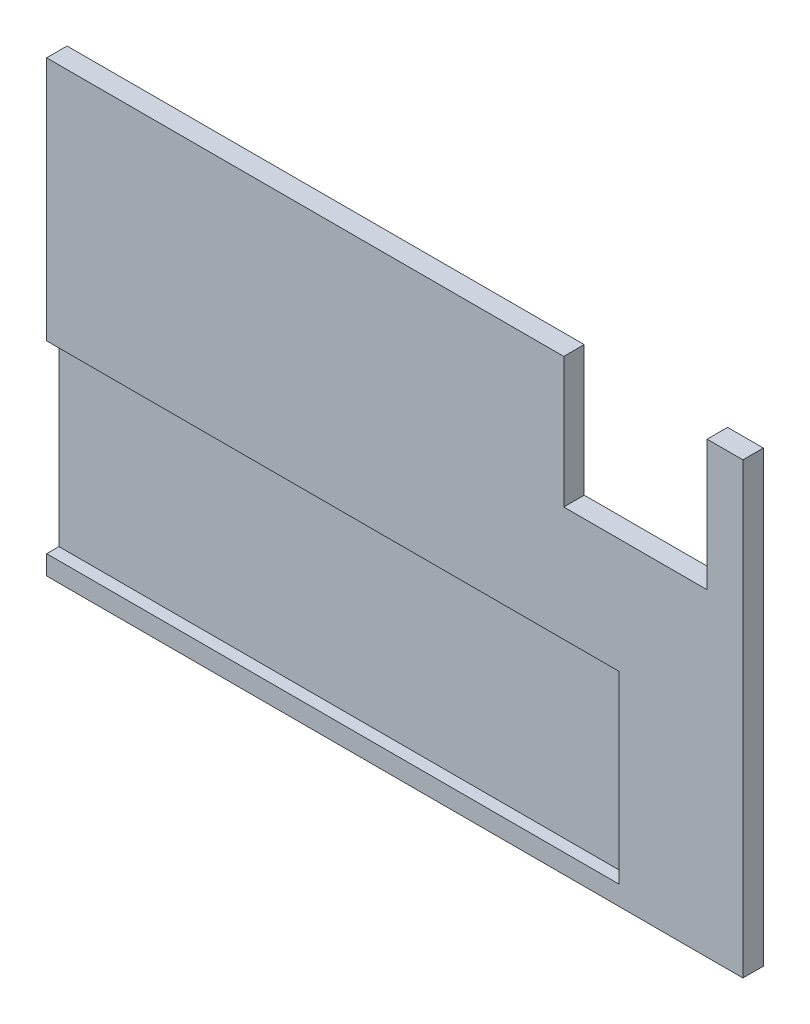
ISO-10303-21;
HEADER;
FILE_DESCRIPTION(('STEP AP214'),'2;1');
FILE_NAME('part.step','',(''),(''),'','','');
FILE_SCHEMA(('AUTOMOTIVE_DESIGN { 1 0 10303 214 1 1 1 1 }'));
ENDSEC;
DATA;
#1=APPLICATION_CONTEXT('core data for automotive mechanical design processes');
#2=APPLICATION_PROTOCOL_DEFINITION('international standard','automotive_design',2000,#1);
#3=PRODUCT_CONTEXT('',#1,'mechanical');
#4=PRODUCT('Part','Part','',(#3));
#5=PRODUCT_RELATED_PRODUCT_CATEGORY('part','',(#4));
#6=PRODUCT_DEFINITION_FORMATION('','',#4);
#7=PRODUCT_DEFINITION_CONTEXT('part definition',#1,'design');
#8=PRODUCT_DEFINITION('design','',#6,#7);
#9=PRODUCT_DEFINITION_SHAPE('','',#8);
#10=(LENGTH_UNIT() NAMED_UNIT(*) SI_UNIT(.MILLI.,.METRE.));
#11=(NAMED_UNIT(*) PLANE_ANGLE_UNIT() SI_UNIT($,.RADIAN.));
#12=(NAMED_UNIT(*) SI_UNIT($,.STERADIAN.) SOLID_ANGLE_UNIT());
#13=UNCERTAINTY_MEASURE_WITH_UNIT(LENGTH_MEASURE(1.E-05),#10,'distance_accuracy_value','');
#14=(GEOMETRIC_REPRESENTATION_CONTEXT(3) GLOBAL_UNCERTAINTY_ASSIGNED_CONTEXT((#13)) GLOBAL_UNIT_ASSIGNED_CONTEXT((#10,
#11,#12)) REPRESENTATION_CONTEXT('',''));
#15=CARTESIAN_POINT('',(0.,0.,0.));
#16=DIRECTION('',(0.,0.,1.));
#17=DIRECTION('',(1.,0.,0.));
#18=AXIS2_PLACEMENT_3D('',#15,#16,#17);
#19=CARTESIAN_POINT('',(-101.259492884196,106.840724775451,5.));
#20=DIRECTION('',(0.,-1.,0.));
#21=DIRECTION('',(0.,0.,-1.));
#22=AXIS2_PLACEMENT_3D('',#19,#20,#21);
#23=PLANE('',#22);
#24=DIRECTION('',(0.,0.,1.));
#25=VECTOR('',#24,1.);
#26=CARTESIAN_POINT('',(25.,106.840724775451,5.));
#27=LINE('',#26,#25);
#28=CARTESIAN_POINT('',(25.,106.840724775451,0.));
#29=VERTEX_POINT('',#28);
#30=CARTESIAN_POINT('',(25.,106.840724775451,5.));
#31=VERTEX_POINT('',#30);
#32=EDGE_CURVE('E136',#29,#31,#27,.T.);
#33=ORIENTED_EDGE('',*,*,#32,.F.);
#34=DIRECTION('',(-1.,0.,0.));
#35=VECTOR('',#34,1.);
#36=CARTESIAN_POINT('',(-101.259492884196,106.840724775451,0.));
#37=LINE('',#36,#35);
#38=CARTESIAN_POINT('',(-101.259492884196,106.840724775451,0.));
#39=VERTEX_POINT('',#38);
#40=EDGE_CURVE('E223',#29,#39,#37,.T.);
#41=ORIENTED_EDGE('',*,*,#40,.T.);
#42=DIRECTION('',(0.,0.,-1.));
#43=VECTOR('',#42,1.);
#44=CARTESIAN_POINT('',(-101.259492884196,106.840724775451,5.));
#45=LINE('',#44,#43);
#46=CARTESIAN_POINT('',(-101.259492884196,106.840724775451,5.));
#47=VERTEX_POINT('',#46);
#48=EDGE_CURVE('E236',#47,#39,#45,.T.);
#49=ORIENTED_EDGE('',*,*,#48,.F.);
#50=DIRECTION('',(-1.,0.,0.));
#51=VECTOR('',#50,1.);
#52=CARTESIAN_POINT('',(-101.259492884196,106.840724775451,5.));
#53=LINE('',#52,#51);
#54=EDGE_CURVE('E211',#31,#47,#53,.T.);
#55=ORIENTED_EDGE('',*,*,#54,.F.);
#56=EDGE_LOOP('',(#33,#41,#49,#55));
#57=FACE_BOUND('',#56,.T.);
#58=ADVANCED_FACE('F39',(#57),#23,.F.);
#59=DIRECTION('',(0.,0.,-1.));
#60=VECTOR('',#59,1.);
#61=CARTESIAN_POINT('',(60.,106.840724775451,5.));
#62=LINE('',#61,#60);
#63=CARTESIAN_POINT('',(60.,106.840724775451,5.));
#64=VERTEX_POINT('',#63);
#65=CARTESIAN_POINT('',(60.,106.840724775451,0.));
#66=VERTEX_POINT('',#65);
#67=EDGE_CURVE('E55',#64,#66,#62,.T.);
#68=ORIENTED_EDGE('',*,*,#67,.F.);
#69=CARTESIAN_POINT('',(68.7405071158039,106.840724775451,5.));
#70=VERTEX_POINT('',#69);
#71=EDGE_CURVE('E212',#70,#64,#53,.T.);
#72=ORIENTED_EDGE('',*,*,#71,.F.);
#73=DIRECTION('',(0.,0.,-1.));
#74=VECTOR('',#73,1.);
#75=CARTESIAN_POINT('',(68.7405071158039,106.840724775451,5.));
#76=LINE('',#75,#74);
#77=CARTESIAN_POINT('',(68.7405071158039,106.840724775451,0.));
#78=VERTEX_POINT('',#77);
#79=EDGE_CURVE('E240',#70,#78,#76,.T.);
#80=ORIENTED_EDGE('',*,*,#79,.T.);
#81=EDGE_CURVE('E224',#78,#66,#37,.T.);
#82=ORIENTED_EDGE('',*,*,#81,.T.);
#83=EDGE_LOOP('',(#68,#72,#80,#82));
#84=FACE_BOUND('',#83,.T.);
#85=ADVANCED_FACE('F283',(#84),#23,.F.);
#86=CARTESIAN_POINT('',(0.,0.,5.));
#87=DIRECTION('',(0.,0.,-1.));
#88=DIRECTION('',(-1.,0.,0.));
#89=AXIS2_PLACEMENT_3D('',#86,#87,#88);
#90=PLANE('',#89);
#91=DIRECTION('',(0.,-1.,0.));
#92=VECTOR('',#91,1.);
#93=CARTESIAN_POINT('',(25.,106.999999999999,5.));
#94=LINE('',#93,#92);
#95=CARTESIAN_POINT('',(25.,75.,5.));
#96=VERTEX_POINT('',#95);
#97=EDGE_CURVE('E131',#31,#96,#94,.T.);
#98=ORIENTED_EDGE('',*,*,#97,.F.);
#99=ORIENTED_EDGE('',*,*,#54,.T.);
#100=DIRECTION('',(0.,-1.,0.));
#101=VECTOR('',#100,1.);
#102=CARTESIAN_POINT('',(-101.259492884196,-2.71815276454902,5.));
#103=LINE('',#102,#101);
#104=CARTESIAN_POINT('',(-101.259492884196,47.,5.));
#105=VERTEX_POINT('',#104);
#106=EDGE_CURVE('E216',#47,#105,#103,.T.);
#107=ORIENTED_EDGE('',*,*,#106,.T.);
#108=DIRECTION('',(-1.,0.,0.));
#109=VECTOR('',#108,1.);
#110=CARTESIAN_POINT('',(-101.52,47.,5.));
#111=LINE('',#110,#109);
#112=CARTESIAN_POINT('',(38.48,47.,5.));
#113=VERTEX_POINT('',#112);
#114=EDGE_CURVE('E176',#113,#105,#111,.T.);
#115=ORIENTED_EDGE('',*,*,#114,.F.);
#116=DIRECTION('',(0.,1.,0.));
#117=VECTOR('',#116,1.);
#118=CARTESIAN_POINT('',(38.48,47.,5.));
#119=LINE('',#118,#117);
#120=CARTESIAN_POINT('',(38.48,2.,5.));
#121=VERTEX_POINT('',#120);
#122=EDGE_CURVE('E171',#121,#113,#119,.T.);
#123=ORIENTED_EDGE('',*,*,#122,.F.);
#124=DIRECTION('',(-1.,0.,0.));
#125=VECTOR('',#124,1.);
#126=CARTESIAN_POINT('',(0.,2.,5.));
#127=LINE('',#126,#125);
#128=CARTESIAN_POINT('',(-101.259492884196,2.,5.));
#129=VERTEX_POINT('',#128);
#130=EDGE_CURVE('E248',#121,#129,#127,.T.);
#131=ORIENTED_EDGE('',*,*,#130,.T.);
#132=CARTESIAN_POINT('',(-101.259492884196,-2.71815276454902,5.));
#133=VERTEX_POINT('',#132);
#134=EDGE_CURVE('E215',#129,#133,#103,.T.);
#135=ORIENTED_EDGE('',*,*,#134,.T.);
#136=DIRECTION('',(1.,0.,0.));
#137=VECTOR('',#136,1.);
#138=CARTESIAN_POINT('',(68.7405071158039,-2.718152764549,5.));
#139=LINE('',#138,#137);
#140=CARTESIAN_POINT('',(68.7405071158039,-2.718152764549,5.));
#141=VERTEX_POINT('',#140);
#142=EDGE_CURVE('E203',#133,#141,#139,.T.);
#143=ORIENTED_EDGE('',*,*,#142,.T.);
#144=DIRECTION('',(0.,1.,0.));
#145=VECTOR('',#144,1.);
#146=CARTESIAN_POINT('',(68.7405071158039,106.840724775451,5.));
#147=LINE('',#146,#145);
#148=EDGE_CURVE('E207',#141,#70,#147,.T.);
#149=ORIENTED_EDGE('',*,*,#148,.T.);
#150=ORIENTED_EDGE('',*,*,#71,.T.);
#151=DIRECTION('',(0.,1.,0.));
#152=VECTOR('',#151,1.);
#153=CARTESIAN_POINT('',(60.,106.999999999999,5.));
#154=LINE('',#153,#152);
#155=CARTESIAN_POINT('',(60.,75.,5.));
#156=VERTEX_POINT('',#155);
#157=EDGE_CURVE('E155',#156,#64,#154,.T.);
#158=ORIENTED_EDGE('',*,*,#157,.F.);
#159=DIRECTION('',(1.,0.,0.));
#160=VECTOR('',#159,1.);
#161=CARTESIAN_POINT('',(25.,75.,5.));
#162=LINE('',#161,#160);
#163=EDGE_CURVE('E141',#96,#156,#162,.T.);
#164=ORIENTED_EDGE('',*,*,#163,.F.);
#165=EDGE_LOOP('',(#98,#99,#107,#115,#123,#131,#135,#143,#149,#150,#158,#164));
#166=FACE_BOUND('',#165,.T.);
#167=ADVANCED_FACE('F153',(#166),#90,.F.);
#168=CARTESIAN_POINT('',(0.,0.,0.));
#169=DIRECTION('',(0.,0.,-1.));
#170=DIRECTION('',(-1.,0.,0.));
#171=AXIS2_PLACEMENT_3D('',#168,#169,#170);
#172=PLANE('',#171);
#173=ORIENTED_EDGE('',*,*,#40,.F.);
#174=DIRECTION('',(0.,-1.,0.));
#175=VECTOR('',#174,1.);
#176=CARTESIAN_POINT('',(25.,0.,0.));
#177=LINE('',#176,#175);
#178=CARTESIAN_POINT('',(25.,75.,0.));
#179=VERTEX_POINT('',#178);
#180=EDGE_CURVE('E11',#29,#179,#177,.T.);
#181=ORIENTED_EDGE('',*,*,#180,.T.);
#182=DIRECTION('',(1.,0.,0.));
#183=VECTOR('',#182,1.);
#184=CARTESIAN_POINT('',(25.,75.,0.));
#185=LINE('',#184,#183);
#186=CARTESIAN_POINT('',(60.,75.,0.));
#187=VERTEX_POINT('',#186);
#188=EDGE_CURVE('E148',#179,#187,#185,.T.);
#189=ORIENTED_EDGE('',*,*,#188,.T.);
#190=DIRECTION('',(0.,1.,0.));
#191=VECTOR('',#190,1.);
#192=CARTESIAN_POINT('',(60.,106.999999999999,0.));
#193=LINE('',#192,#191);
#194=EDGE_CURVE('E142',#187,#66,#193,.T.);
#195=ORIENTED_EDGE('',*,*,#194,.T.);
#196=ORIENTED_EDGE('',*,*,#81,.F.);
#197=DIRECTION('',(0.,1.,0.));
#198=VECTOR('',#197,1.);
#199=CARTESIAN_POINT('',(68.7405071158039,106.840724775451,0.));
#200=LINE('',#199,#198);
#201=CARTESIAN_POINT('',(68.7405071158039,-2.718152764549,0.));
#202=VERTEX_POINT('',#201);
#203=EDGE_CURVE('E202',#202,#78,#200,.T.);
#204=ORIENTED_EDGE('',*,*,#203,.F.);
#205=DIRECTION('',(1.,0.,0.));
#206=VECTOR('',#205,1.);
#207=CARTESIAN_POINT('',(0.,-2.71815276454901,0.));
#208=LINE('',#207,#206);
#209=CARTESIAN_POINT('',(-101.259492884196,-2.71815276454902,0.));
#210=VERTEX_POINT('',#209);
#211=EDGE_CURVE('E208',#210,#202,#208,.T.);
#212=ORIENTED_EDGE('',*,*,#211,.F.);
#213=DIRECTION('',(0.,-1.,0.));
#214=VECTOR('',#213,1.);
#215=CARTESIAN_POINT('',(-101.259492884196,-2.71815276454902,0.));
#216=LINE('',#215,#214);
#217=EDGE_CURVE('E228',#39,#210,#216,.T.);
#218=ORIENTED_EDGE('',*,*,#217,.F.);
#219=EDGE_LOOP('',(#173,#181,#189,#195,#196,#204,#212,#218));
#220=FACE_BOUND('',#219,.T.);
#221=ADVANCED_FACE('F273',(#220),#172,.T.);
#222=CARTESIAN_POINT('',(68.7405071158039,106.840724775451,5.));
#223=DIRECTION('',(-1.,0.,0.));
#224=DIRECTION('',(0.,-1.,0.));
#225=AXIS2_PLACEMENT_3D('',#222,#223,#224);
#226=PLANE('',#225);
#227=ORIENTED_EDGE('',*,*,#203,.T.);
#228=ORIENTED_EDGE('',*,*,#79,.F.);
#229=ORIENTED_EDGE('',*,*,#148,.F.);
#230=DIRECTION('',(0.,0.,-1.));
#231=VECTOR('',#230,1.);
#232=CARTESIAN_POINT('',(68.7405071158039,-2.718152764549,5.));
#233=LINE('',#232,#231);
#234=EDGE_CURVE('E244',#141,#202,#233,.T.);
#235=ORIENTED_EDGE('',*,*,#234,.T.);
#236=EDGE_LOOP('',(#227,#228,#229,#235));
#237=FACE_BOUND('',#236,.T.);
#238=ADVANCED_FACE('F41',(#237),#226,.F.);
#239=CARTESIAN_POINT('',(-101.259492884196,-2.71815276454902,5.));
#240=DIRECTION('',(1.,0.,0.));
#241=DIRECTION('',(0.,0.,-1.));
#242=AXIS2_PLACEMENT_3D('',#239,#240,#241);
#243=PLANE('',#242);
#244=DIRECTION('',(0.,-1.,0.));
#245=VECTOR('',#244,1.);
#246=CARTESIAN_POINT('',(-101.259492884196,-2.71815276454902,2.));
#247=LINE('',#246,#245);
#248=CARTESIAN_POINT('',(-101.259492884196,47.,2.));
#249=VERTEX_POINT('',#248);
#250=CARTESIAN_POINT('',(-101.259492884196,2.,2.));
#251=VERTEX_POINT('',#250);
#252=EDGE_CURVE('E48',#249,#251,#247,.T.);
#253=ORIENTED_EDGE('',*,*,#252,.F.);
#254=DIRECTION('',(0.,0.,1.));
#255=VECTOR('',#254,1.);
#256=CARTESIAN_POINT('',(-101.259492884196,47.,5.));
#257=LINE('',#256,#255);
#258=EDGE_CURVE('E198',#249,#105,#257,.T.);
#259=ORIENTED_EDGE('',*,*,#258,.T.);
#260=ORIENTED_EDGE('',*,*,#106,.F.);
#261=ORIENTED_EDGE('',*,*,#48,.T.);
#262=ORIENTED_EDGE('',*,*,#217,.T.);
#263=DIRECTION('',(0.,0.,-1.));
#264=VECTOR('',#263,1.);
#265=CARTESIAN_POINT('',(-101.259492884196,-2.71815276454902,5.));
#266=LINE('',#265,#264);
#267=EDGE_CURVE('E220',#133,#210,#266,.T.);
#268=ORIENTED_EDGE('',*,*,#267,.F.);
#269=ORIENTED_EDGE('',*,*,#134,.F.);
#270=DIRECTION('',(0.,0.,-1.));
#271=VECTOR('',#270,1.);
#272=CARTESIAN_POINT('',(-101.259492884196,2.,5.));
#273=LINE('',#272,#271);
#274=EDGE_CURVE('E63',#129,#251,#273,.T.);
#275=ORIENTED_EDGE('',*,*,#274,.T.);
#276=EDGE_LOOP('',(#253,#259,#260,#261,#262,#268,#269,#275));
#277=FACE_BOUND('',#276,.T.);
#278=ADVANCED_FACE('F260',(#277),#243,.F.);
#279=CARTESIAN_POINT('',(0.,-2.71815276454901,5.));
#280=DIRECTION('',(0.,1.,0.));
#281=DIRECTION('',(-1.,0.,0.));
#282=AXIS2_PLACEMENT_3D('',#279,#280,#281);
#283=PLANE('',#282);
#284=ORIENTED_EDGE('',*,*,#211,.T.);
#285=ORIENTED_EDGE('',*,*,#234,.F.);
#286=ORIENTED_EDGE('',*,*,#142,.F.);
#287=ORIENTED_EDGE('',*,*,#267,.T.);
#288=EDGE_LOOP('',(#284,#285,#286,#287));
#289=FACE_BOUND('',#288,.T.);
#290=ADVANCED_FACE('F278',(#289),#283,.F.);
#291=CARTESIAN_POINT('',(0.,0.,2.));
#292=DIRECTION('',(0.,0.,1.));
#293=DIRECTION('',(1.,0.,0.));
#294=AXIS2_PLACEMENT_3D('',#291,#292,#293);
#295=PLANE('',#294);
#296=ORIENTED_EDGE('',*,*,#252,.T.);
#297=DIRECTION('',(1.,0.,0.));
#298=VECTOR('',#297,1.);
#299=CARTESIAN_POINT('',(-101.52,2.,2.));
#300=LINE('',#299,#298);
#301=CARTESIAN_POINT('',(38.48,2.,2.));
#302=VERTEX_POINT('',#301);
#303=EDGE_CURVE('E172',#251,#302,#300,.T.);
#304=ORIENTED_EDGE('',*,*,#303,.T.);
#305=DIRECTION('',(0.,1.,0.));
#306=VECTOR('',#305,1.);
#307=CARTESIAN_POINT('',(38.48,47.,2.));
#308=LINE('',#307,#306);
#309=CARTESIAN_POINT('',(38.48,47.,2.));
#310=VERTEX_POINT('',#309);
#311=EDGE_CURVE('E175',#302,#310,#308,.T.);
#312=ORIENTED_EDGE('',*,*,#311,.T.);
#313=DIRECTION('',(-1.,0.,0.));
#314=VECTOR('',#313,1.);
#315=CARTESIAN_POINT('',(-101.52,47.,2.));
#316=LINE('',#315,#314);
#317=EDGE_CURVE('E180',#310,#249,#316,.T.);
#318=ORIENTED_EDGE('',*,*,#317,.T.);
#319=EDGE_LOOP('',(#296,#304,#312,#318));
#320=FACE_BOUND('',#319,.T.);
#321=ADVANCED_FACE('F253',(#320),#295,.T.);
#322=CARTESIAN_POINT('',(-101.52,47.,2.));
#323=DIRECTION('',(0.,1.,0.));
#324=DIRECTION('',(0.,0.,1.));
#325=AXIS2_PLACEMENT_3D('',#322,#323,#324);
#326=PLANE('',#325);
#327=ORIENTED_EDGE('',*,*,#317,.F.);
#328=DIRECTION('',(0.,0.,1.));
#329=VECTOR('',#328,1.);
#330=CARTESIAN_POINT('',(38.48,47.,2.));
#331=LINE('',#330,#329);
#332=EDGE_CURVE('E190',#310,#113,#331,.T.);
#333=ORIENTED_EDGE('',*,*,#332,.T.);
#334=ORIENTED_EDGE('',*,*,#114,.T.);
#335=ORIENTED_EDGE('',*,*,#258,.F.);
#336=EDGE_LOOP('',(#327,#333,#334,#335));
#337=FACE_BOUND('',#336,.T.);
#338=ADVANCED_FACE('F309',(#337),#326,.F.);
#339=CARTESIAN_POINT('',(-101.52,2.,2.));
#340=DIRECTION('',(0.,-1.,0.));
#341=DIRECTION('',(0.,0.,-1.));
#342=AXIS2_PLACEMENT_3D('',#339,#340,#341);
#343=PLANE('',#342);
#344=ORIENTED_EDGE('',*,*,#130,.F.);
#345=DIRECTION('',(0.,0.,1.));
#346=VECTOR('',#345,1.);
#347=CARTESIAN_POINT('',(38.48,2.,2.));
#348=LINE('',#347,#346);
#349=EDGE_CURVE('E184',#302,#121,#348,.T.);
#350=ORIENTED_EDGE('',*,*,#349,.F.);
#351=ORIENTED_EDGE('',*,*,#303,.F.);
#352=ORIENTED_EDGE('',*,*,#274,.F.);
#353=EDGE_LOOP('',(#344,#350,#351,#352));
#354=FACE_BOUND('',#353,.T.);
#355=ADVANCED_FACE('F257',(#354),#343,.F.);
#356=CARTESIAN_POINT('',(38.48,47.,2.));
#357=DIRECTION('',(1.,0.,0.));
#358=DIRECTION('',(0.,1.,0.));
#359=AXIS2_PLACEMENT_3D('',#356,#357,#358);
#360=PLANE('',#359);
#361=ORIENTED_EDGE('',*,*,#122,.T.);
#362=ORIENTED_EDGE('',*,*,#332,.F.);
#363=ORIENTED_EDGE('',*,*,#311,.F.);
#364=ORIENTED_EDGE('',*,*,#349,.T.);
#365=EDGE_LOOP('',(#361,#362,#363,#364));
#366=FACE_BOUND('',#365,.T.);
#367=ADVANCED_FACE('F292',(#366),#360,.F.);
#368=CARTESIAN_POINT('',(25.,106.999999999999,5.));
#369=DIRECTION('',(1.,0.,0.));
#370=DIRECTION('',(0.,1.,0.));
#371=AXIS2_PLACEMENT_3D('',#368,#369,#370);
#372=PLANE('',#371);
#373=ORIENTED_EDGE('',*,*,#32,.T.);
#374=ORIENTED_EDGE('',*,*,#97,.T.);
#375=DIRECTION('',(0.,0.,-1.));
#376=VECTOR('',#375,1.);
#377=CARTESIAN_POINT('',(25.,75.,5.));
#378=LINE('',#377,#376);
#379=EDGE_CURVE('E134',#96,#179,#378,.T.);
#380=ORIENTED_EDGE('',*,*,#379,.T.);
#381=ORIENTED_EDGE('',*,*,#180,.F.);
#382=EDGE_LOOP('',(#373,#374,#380,#381));
#383=FACE_BOUND('',#382,.T.);
#384=ADVANCED_FACE('F133',(#383),#372,.T.);
#385=CARTESIAN_POINT('',(60.,106.999999999999,5.));
#386=DIRECTION('',(-1.,0.,0.));
#387=DIRECTION('',(0.,0.,1.));
#388=AXIS2_PLACEMENT_3D('',#385,#386,#387);
#389=PLANE('',#388);
#390=ORIENTED_EDGE('',*,*,#67,.T.);
#391=ORIENTED_EDGE('',*,*,#194,.F.);
#392=DIRECTION('',(0.,0.,-1.));
#393=VECTOR('',#392,1.);
#394=CARTESIAN_POINT('',(60.,75.,5.));
#395=LINE('',#394,#393);
#396=EDGE_CURVE('E150',#156,#187,#395,.T.);
#397=ORIENTED_EDGE('',*,*,#396,.F.);
#398=ORIENTED_EDGE('',*,*,#157,.T.);
#399=EDGE_LOOP('',(#390,#391,#397,#398));
#400=FACE_BOUND('',#399,.T.);
#401=ADVANCED_FACE('F284',(#400),#389,.T.);
#402=CARTESIAN_POINT('',(25.,75.,5.));
#403=DIRECTION('',(0.,1.,0.));
#404=DIRECTION('',(0.,0.,1.));
#405=AXIS2_PLACEMENT_3D('',#402,#403,#404);
#406=PLANE('',#405);
#407=ORIENTED_EDGE('',*,*,#188,.F.);
#408=ORIENTED_EDGE('',*,*,#379,.F.);
#409=ORIENTED_EDGE('',*,*,#163,.T.);
#410=ORIENTED_EDGE('',*,*,#396,.T.);
#411=EDGE_LOOP('',(#407,#408,#409,#410));
#412=FACE_BOUND('',#411,.T.);
#413=ADVANCED_FACE('F145',(#412),#406,.T.);
#414=CLOSED_SHELL('',(#58,#85,#167,#221,#238,#278,#290,#321,#338,#355,#367,#384,#401,#413));
#415=MANIFOLD_SOLID_BREP('B2',#414);
#416=ADVANCED_BREP_SHAPE_REPRESENTATION('',(#18,#415),#14);
#417=SHAPE_DEFINITION_REPRESENTATION(#9,#416);
ENDSEC;
END-ISO-10303-21;
